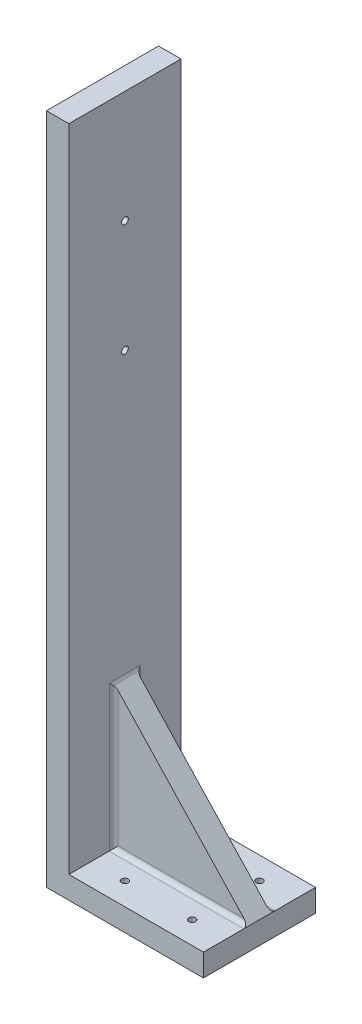
ISO-10303-21;
HEADER;
FILE_DESCRIPTION(('STEP AP214'),'2;1');
FILE_NAME('part.step','',(''),(''),'','','');
FILE_SCHEMA(('AUTOMOTIVE_DESIGN { 1 0 10303 214 1 1 1 1 }'));
ENDSEC;
DATA;
#1=APPLICATION_CONTEXT('core data for automotive mechanical design processes');
#2=APPLICATION_PROTOCOL_DEFINITION('international standard','automotive_design',2000,#1);
#3=PRODUCT_CONTEXT('',#1,'mechanical');
#4=PRODUCT('Part','Part','',(#3));
#5=PRODUCT_RELATED_PRODUCT_CATEGORY('part','',(#4));
#6=PRODUCT_DEFINITION_FORMATION('','',#4);
#7=PRODUCT_DEFINITION_CONTEXT('part definition',#1,'design');
#8=PRODUCT_DEFINITION('design','',#6,#7);
#9=PRODUCT_DEFINITION_SHAPE('','',#8);
#10=(LENGTH_UNIT() NAMED_UNIT(*) SI_UNIT(.MILLI.,.METRE.));
#11=(NAMED_UNIT(*) PLANE_ANGLE_UNIT() SI_UNIT($,.RADIAN.));
#12=(NAMED_UNIT(*) SI_UNIT($,.STERADIAN.) SOLID_ANGLE_UNIT());
#13=UNCERTAINTY_MEASURE_WITH_UNIT(LENGTH_MEASURE(1.E-05),#10,'distance_accuracy_value','');
#14=(GEOMETRIC_REPRESENTATION_CONTEXT(3) GLOBAL_UNCERTAINTY_ASSIGNED_CONTEXT((#13)) GLOBAL_UNIT_ASSIGNED_CONTEXT((#10,
#11,#12)) REPRESENTATION_CONTEXT('',''));
#15=CARTESIAN_POINT('',(0.,0.,0.));
#16=DIRECTION('',(0.,0.,1.));
#17=DIRECTION('',(1.,0.,0.));
#18=AXIS2_PLACEMENT_3D('',#15,#16,#17);
#19=CARTESIAN_POINT('',(0.,-213.28125,25.));
#20=DIRECTION('',(-1.,0.,0.));
#21=DIRECTION('',(0.,-1.,0.));
#22=AXIS2_PLACEMENT_3D('',#19,#20,#21);
#23=PLANE('',#22);
#24=CARTESIAN_POINT('',(0.,26.7187499999996,0.));
#25=DIRECTION('',(1.,0.,0.));
#26=DIRECTION('',(0.,1.,0.));
#27=AXIS2_PLACEMENT_3D('',#24,#25,#26);
#28=CIRCLE('',#27,1.5);
#29=CARTESIAN_POINT('',(0.,28.2187499999996,0.));
#30=VERTEX_POINT('',#29);
#31=EDGE_CURVE('E412',#30,#30,#28,.T.);
#32=ORIENTED_EDGE('',*,*,#31,.F.);
#33=EDGE_LOOP('',(#32));
#34=FACE_BOUND('',#33,.T.);
#35=CARTESIAN_POINT('',(0.,-23.2812500000004,0.));
#36=DIRECTION('',(1.,0.,0.));
#37=DIRECTION('',(0.,1.,0.));
#38=AXIS2_PLACEMENT_3D('',#35,#36,#37);
#39=CIRCLE('',#38,1.5);
#40=CARTESIAN_POINT('',(0.,-21.7812500000004,0.));
#41=VERTEX_POINT('',#40);
#42=EDGE_CURVE('E408',#41,#41,#39,.T.);
#43=ORIENTED_EDGE('',*,*,#42,.F.);
#44=EDGE_LOOP('',(#43));
#45=FACE_BOUND('',#44,.T.);
#46=DIRECTION('',(0.,0.,1.));
#47=VECTOR('',#46,1.);
#48=CARTESIAN_POINT('',(0.,-148.386625426611,-5.));
#49=LINE('',#48,#47);
#50=CARTESIAN_POINT('',(0.,-148.386625426611,7.));
#51=VERTEX_POINT('',#50);
#52=CARTESIAN_POINT('',(0.,-148.386625426611,-7.));
#53=VERTEX_POINT('',#52);
#54=EDGE_CURVE('E207',#51,#53,#49,.F.);
#55=ORIENTED_EDGE('',*,*,#54,.T.);
#56=DIRECTION('',(0.,1.,0.));
#57=VECTOR('',#56,1.);
#58=CARTESIAN_POINT('',(0.,-213.28125,-7.));
#59=LINE('',#58,#57);
#60=CARTESIAN_POINT('',(0.,-213.28125,-7.));
#61=VERTEX_POINT('',#60);
#62=EDGE_CURVE('E210',#53,#61,#59,.F.);
#63=ORIENTED_EDGE('',*,*,#62,.T.);
#64=DIRECTION('',(0.,0.,-1.));
#65=VECTOR('',#64,1.);
#66=CARTESIAN_POINT('',(0.,-213.28125,25.));
#67=LINE('',#66,#65);
#68=CARTESIAN_POINT('',(0.,-213.28125,-25.));
#69=VERTEX_POINT('',#68);
#70=EDGE_CURVE('E290',#61,#69,#67,.T.);
#71=ORIENTED_EDGE('',*,*,#70,.T.);
#72=DIRECTION('',(0.,1.,0.));
#73=VECTOR('',#72,1.);
#74=CARTESIAN_POINT('',(0.,-213.28125,-25.));
#75=LINE('',#74,#73);
#76=CARTESIAN_POINT('',(0.,76.7187499999996,-25.));
#77=VERTEX_POINT('',#76);
#78=EDGE_CURVE('E175',#69,#77,#75,.T.);
#79=ORIENTED_EDGE('',*,*,#78,.T.);
#80=DIRECTION('',(0.,0.,-1.));
#81=VECTOR('',#80,1.);
#82=CARTESIAN_POINT('',(0.,76.7187499999996,25.));
#83=LINE('',#82,#81);
#84=CARTESIAN_POINT('',(0.,76.7187499999996,25.));
#85=VERTEX_POINT('',#84);
#86=EDGE_CURVE('E155',#85,#77,#83,.T.);
#87=ORIENTED_EDGE('',*,*,#86,.F.);
#88=DIRECTION('',(0.,1.,0.));
#89=VECTOR('',#88,1.);
#90=CARTESIAN_POINT('',(0.,-213.28125,25.));
#91=LINE('',#90,#89);
#92=CARTESIAN_POINT('',(0.,-213.28125,25.));
#93=VERTEX_POINT('',#92);
#94=EDGE_CURVE('E162',#93,#85,#91,.T.);
#95=ORIENTED_EDGE('',*,*,#94,.F.);
#96=CARTESIAN_POINT('',(0.,-213.28125,7.00000000000001));
#97=VERTEX_POINT('',#96);
#98=EDGE_CURVE('E309',#93,#97,#67,.T.);
#99=ORIENTED_EDGE('',*,*,#98,.T.);
#100=DIRECTION('',(0.,-1.,0.));
#101=VECTOR('',#100,1.);
#102=CARTESIAN_POINT('',(0.,-149.176577693889,7.));
#103=LINE('',#102,#101);
#104=EDGE_CURVE('E181',#97,#51,#103,.F.);
#105=ORIENTED_EDGE('',*,*,#104,.T.);
#106=EDGE_LOOP('',(#55,#63,#71,#79,#87,#95,#99,#105));
#107=FACE_BOUND('',#106,.T.);
#108=ADVANCED_FACE('F44',(#34,#45,#107),#23,.F.);
#109=CARTESIAN_POINT('',(60.,-213.28125,25.));
#110=DIRECTION('',(0.,-1.,0.));
#111=DIRECTION('',(0.,0.,-1.));
#112=AXIS2_PLACEMENT_3D('',#109,#110,#111);
#113=PLANE('',#112);
#114=CARTESIAN_POINT('',(45.,-213.28125,15.));
#115=DIRECTION('',(0.,1.,0.));
#116=DIRECTION('',(0.,0.,-1.));
#117=AXIS2_PLACEMENT_3D('',#114,#115,#116);
#118=CIRCLE('',#117,1.5);
#119=CARTESIAN_POINT('',(45.,-213.28125,13.5));
#120=VERTEX_POINT('',#119);
#121=EDGE_CURVE('E259',#120,#120,#118,.T.);
#122=ORIENTED_EDGE('',*,*,#121,.F.);
#123=EDGE_LOOP('',(#122));
#124=FACE_BOUND('',#123,.T.);
#125=CARTESIAN_POINT('',(15.,-213.28125,15.));
#126=DIRECTION('',(0.,1.,0.));
#127=DIRECTION('',(0.,0.,1.));
#128=AXIS2_PLACEMENT_3D('',#125,#126,#127);
#129=CIRCLE('',#128,1.5);
#130=CARTESIAN_POINT('',(15.,-213.28125,16.5));
#131=VERTEX_POINT('',#130);
#132=EDGE_CURVE('E265',#131,#131,#129,.T.);
#133=ORIENTED_EDGE('',*,*,#132,.F.);
#134=EDGE_LOOP('',(#133));
#135=FACE_BOUND('',#134,.T.);
#136=DIRECTION('',(0.,0.,-1.));
#137=VECTOR('',#136,1.);
#138=CARTESIAN_POINT('',(60.,-213.28125,25.));
#139=LINE('',#138,#137);
#140=CARTESIAN_POINT('',(60.,-213.28125,25.));
#141=VERTEX_POINT('',#140);
#142=CARTESIAN_POINT('',(60.,-213.28125,7.00000000000001));
#143=VERTEX_POINT('',#142);
#144=EDGE_CURVE('E313',#141,#143,#139,.T.);
#145=ORIENTED_EDGE('',*,*,#144,.T.);
#146=DIRECTION('',(-1.,0.,0.));
#147=VECTOR('',#146,1.);
#148=CARTESIAN_POINT('',(0.,-213.28125,7.00000000000001));
#149=LINE('',#148,#147);
#150=EDGE_CURVE('E221',#143,#97,#149,.T.);
#151=ORIENTED_EDGE('',*,*,#150,.T.);
#152=ORIENTED_EDGE('',*,*,#98,.F.);
#153=DIRECTION('',(-1.,0.,0.));
#154=VECTOR('',#153,1.);
#155=CARTESIAN_POINT('',(60.,-213.28125,25.));
#156=LINE('',#155,#154);
#157=EDGE_CURVE('E167',#141,#93,#156,.T.);
#158=ORIENTED_EDGE('',*,*,#157,.F.);
#159=EDGE_LOOP('',(#145,#151,#152,#158));
#160=FACE_BOUND('',#159,.T.);
#161=ADVANCED_FACE('F352',(#124,#135,#160),#113,.F.);
#162=CARTESIAN_POINT('',(45.,-213.28125,-15.));
#163=DIRECTION('',(0.,1.,0.));
#164=DIRECTION('',(0.,0.,-1.));
#165=AXIS2_PLACEMENT_3D('',#162,#163,#164);
#166=CIRCLE('',#165,1.5);
#167=CARTESIAN_POINT('',(45.,-213.28125,-16.5));
#168=VERTEX_POINT('',#167);
#169=EDGE_CURVE('E253',#168,#168,#166,.T.);
#170=ORIENTED_EDGE('',*,*,#169,.F.);
#171=EDGE_LOOP('',(#170));
#172=FACE_BOUND('',#171,.T.);
#173=CARTESIAN_POINT('',(15.,-213.28125,-15.));
#174=DIRECTION('',(0.,1.,0.));
#175=DIRECTION('',(0.,0.,1.));
#176=AXIS2_PLACEMENT_3D('',#173,#174,#175);
#177=CIRCLE('',#176,1.5);
#178=CARTESIAN_POINT('',(15.,-213.28125,-13.5));
#179=VERTEX_POINT('',#178);
#180=EDGE_CURVE('E192',#179,#179,#177,.T.);
#181=ORIENTED_EDGE('',*,*,#180,.F.);
#182=EDGE_LOOP('',(#181));
#183=FACE_BOUND('',#182,.T.);
#184=ORIENTED_EDGE('',*,*,#70,.F.);
#185=DIRECTION('',(-1.,0.,0.));
#186=VECTOR('',#185,1.);
#187=CARTESIAN_POINT('',(60.,-213.28125,-7.));
#188=LINE('',#187,#186);
#189=CARTESIAN_POINT('',(60.,-213.28125,-7.));
#190=VERTEX_POINT('',#189);
#191=EDGE_CURVE('E218',#61,#190,#188,.F.);
#192=ORIENTED_EDGE('',*,*,#191,.T.);
#193=CARTESIAN_POINT('',(60.,-213.28125,-25.));
#194=VERTEX_POINT('',#193);
#195=EDGE_CURVE('E312',#190,#194,#139,.T.);
#196=ORIENTED_EDGE('',*,*,#195,.T.);
#197=DIRECTION('',(-1.,0.,0.));
#198=VECTOR('',#197,1.);
#199=CARTESIAN_POINT('',(60.,-213.28125,-25.));
#200=LINE('',#199,#198);
#201=EDGE_CURVE('E172',#194,#69,#200,.T.);
#202=ORIENTED_EDGE('',*,*,#201,.T.);
#203=EDGE_LOOP('',(#184,#192,#196,#202));
#204=FACE_BOUND('',#203,.T.);
#205=ADVANCED_FACE('F348',(#172,#183,#204),#113,.F.);
#206=CARTESIAN_POINT('',(0.,76.7187499999996,25.));
#207=DIRECTION('',(0.,-1.,0.));
#208=DIRECTION('',(0.,0.,-1.));
#209=AXIS2_PLACEMENT_3D('',#206,#207,#208);
#210=PLANE('',#209);
#211=DIRECTION('',(-1.,0.,0.));
#212=VECTOR('',#211,1.);
#213=CARTESIAN_POINT('',(0.,76.7187499999996,-25.));
#214=LINE('',#213,#212);
#215=CARTESIAN_POINT('',(-10.,76.7187499999996,-25.));
#216=VERTEX_POINT('',#215);
#217=EDGE_CURVE('E293',#77,#216,#214,.T.);
#218=ORIENTED_EDGE('',*,*,#217,.T.);
#219=DIRECTION('',(0.,0.,-1.));
#220=VECTOR('',#219,1.);
#221=CARTESIAN_POINT('',(-10.,76.7187499999996,25.));
#222=LINE('',#221,#220);
#223=CARTESIAN_POINT('',(-10.,76.7187499999996,25.));
#224=VERTEX_POINT('',#223);
#225=EDGE_CURVE('E157',#224,#216,#222,.T.);
#226=ORIENTED_EDGE('',*,*,#225,.F.);
#227=DIRECTION('',(-1.,0.,0.));
#228=VECTOR('',#227,1.);
#229=CARTESIAN_POINT('',(0.,76.7187499999996,25.));
#230=LINE('',#229,#228);
#231=EDGE_CURVE('E151',#85,#224,#230,.T.);
#232=ORIENTED_EDGE('',*,*,#231,.F.);
#233=ORIENTED_EDGE('',*,*,#86,.T.);
#234=EDGE_LOOP('',(#218,#226,#232,#233));
#235=FACE_BOUND('',#234,.T.);
#236=ADVANCED_FACE('F153',(#235),#210,.F.);
#237=CARTESIAN_POINT('',(-10.,76.7187499999996,25.));
#238=DIRECTION('',(1.,0.,0.));
#239=DIRECTION('',(0.,1.,0.));
#240=AXIS2_PLACEMENT_3D('',#237,#238,#239);
#241=PLANE('',#240);
#242=CARTESIAN_POINT('',(-10.,26.7187499999996,0.));
#243=DIRECTION('',(1.,0.,0.));
#244=DIRECTION('',(0.,1.,0.));
#245=AXIS2_PLACEMENT_3D('',#242,#243,#244);
#246=CIRCLE('',#245,1.5);
#247=CARTESIAN_POINT('',(-10.,28.2187499999996,0.));
#248=VERTEX_POINT('',#247);
#249=EDGE_CURVE('E242',#248,#248,#246,.T.);
#250=ORIENTED_EDGE('',*,*,#249,.T.);
#251=EDGE_LOOP('',(#250));
#252=FACE_BOUND('',#251,.T.);
#253=CARTESIAN_POINT('',(-10.,-23.2812500000004,0.));
#254=DIRECTION('',(1.,0.,0.));
#255=DIRECTION('',(0.,1.,0.));
#256=AXIS2_PLACEMENT_3D('',#253,#254,#255);
#257=CIRCLE('',#256,1.5);
#258=CARTESIAN_POINT('',(-10.,-21.7812500000004,0.));
#259=VERTEX_POINT('',#258);
#260=EDGE_CURVE('E404',#259,#259,#257,.T.);
#261=ORIENTED_EDGE('',*,*,#260,.T.);
#262=EDGE_LOOP('',(#261));
#263=FACE_BOUND('',#262,.T.);
#264=DIRECTION('',(0.,-1.,0.));
#265=VECTOR('',#264,1.);
#266=CARTESIAN_POINT('',(-10.,76.7187499999996,-25.));
#267=LINE('',#266,#265);
#268=CARTESIAN_POINT('',(-9.99999999999996,-223.28125,-25.));
#269=VERTEX_POINT('',#268);
#270=EDGE_CURVE('E296',#216,#269,#267,.T.);
#271=ORIENTED_EDGE('',*,*,#270,.T.);
#272=DIRECTION('',(0.,0.,-1.));
#273=VECTOR('',#272,1.);
#274=CARTESIAN_POINT('',(-9.99999999999996,-223.28125,25.));
#275=LINE('',#274,#273);
#276=CARTESIAN_POINT('',(-9.99999999999996,-223.28125,25.));
#277=VERTEX_POINT('',#276);
#278=EDGE_CURVE('E183',#277,#269,#275,.T.);
#279=ORIENTED_EDGE('',*,*,#278,.F.);
#280=DIRECTION('',(0.,-1.,0.));
#281=VECTOR('',#280,1.);
#282=CARTESIAN_POINT('',(-10.,76.7187499999996,25.));
#283=LINE('',#282,#281);
#284=EDGE_CURVE('E161',#224,#277,#283,.T.);
#285=ORIENTED_EDGE('',*,*,#284,.F.);
#286=ORIENTED_EDGE('',*,*,#225,.T.);
#287=EDGE_LOOP('',(#271,#279,#285,#286));
#288=FACE_BOUND('',#287,.T.);
#289=ADVANCED_FACE('F336',(#252,#263,#288),#241,.F.);
#290=CARTESIAN_POINT('',(-9.99999999999996,-223.28125,25.));
#291=DIRECTION('',(0.,1.,0.));
#292=DIRECTION('',(0.,0.,1.));
#293=AXIS2_PLACEMENT_3D('',#290,#291,#292);
#294=PLANE('',#293);
#295=CARTESIAN_POINT('',(45.,-223.28125,-15.));
#296=DIRECTION('',(0.,1.,0.));
#297=DIRECTION('',(0.,0.,1.));
#298=AXIS2_PLACEMENT_3D('',#295,#296,#297);
#299=CIRCLE('',#298,1.5);
#300=CARTESIAN_POINT('',(45.,-223.28125,-13.5));
#301=VERTEX_POINT('',#300);
#302=EDGE_CURVE('E200',#301,#301,#299,.T.);
#303=ORIENTED_EDGE('',*,*,#302,.T.);
#304=EDGE_LOOP('',(#303));
#305=FACE_BOUND('',#304,.T.);
#306=CARTESIAN_POINT('',(45.,-223.28125,15.));
#307=DIRECTION('',(0.,1.,0.));
#308=DIRECTION('',(0.,0.,1.));
#309=AXIS2_PLACEMENT_3D('',#306,#307,#308);
#310=CIRCLE('',#309,1.5);
#311=CARTESIAN_POINT('',(45.,-223.28125,16.5));
#312=VERTEX_POINT('',#311);
#313=EDGE_CURVE('E196',#312,#312,#310,.T.);
#314=ORIENTED_EDGE('',*,*,#313,.T.);
#315=EDGE_LOOP('',(#314));
#316=FACE_BOUND('',#315,.T.);
#317=CARTESIAN_POINT('',(15.,-223.28125,15.));
#318=DIRECTION('',(0.,1.,0.));
#319=DIRECTION('',(0.,0.,1.));
#320=AXIS2_PLACEMENT_3D('',#317,#318,#319);
#321=CIRCLE('',#320,1.5);
#322=CARTESIAN_POINT('',(15.,-223.28125,16.5));
#323=VERTEX_POINT('',#322);
#324=EDGE_CURVE('E191',#323,#323,#321,.T.);
#325=ORIENTED_EDGE('',*,*,#324,.T.);
#326=EDGE_LOOP('',(#325));
#327=FACE_BOUND('',#326,.T.);
#328=CARTESIAN_POINT('',(15.,-223.28125,-15.));
#329=DIRECTION('',(0.,1.,0.));
#330=DIRECTION('',(0.,0.,1.));
#331=AXIS2_PLACEMENT_3D('',#328,#329,#330);
#332=CIRCLE('',#331,1.5);
#333=CARTESIAN_POINT('',(15.,-223.28125,-13.5));
#334=VERTEX_POINT('',#333);
#335=EDGE_CURVE('E187',#334,#334,#332,.T.);
#336=ORIENTED_EDGE('',*,*,#335,.T.);
#337=EDGE_LOOP('',(#336));
#338=FACE_BOUND('',#337,.T.);
#339=DIRECTION('',(1.,0.,0.));
#340=VECTOR('',#339,1.);
#341=CARTESIAN_POINT('',(-9.99999999999996,-223.28125,-25.));
#342=LINE('',#341,#340);
#343=CARTESIAN_POINT('',(60.,-223.28125,-25.));
#344=VERTEX_POINT('',#343);
#345=EDGE_CURVE('E299',#269,#344,#342,.T.);
#346=ORIENTED_EDGE('',*,*,#345,.T.);
#347=DIRECTION('',(0.,0.,-1.));
#348=VECTOR('',#347,1.);
#349=CARTESIAN_POINT('',(60.,-223.28125,25.));
#350=LINE('',#349,#348);
#351=CARTESIAN_POINT('',(60.,-223.28125,25.));
#352=VERTEX_POINT('',#351);
#353=EDGE_CURVE('E316',#352,#344,#350,.T.);
#354=ORIENTED_EDGE('',*,*,#353,.F.);
#355=DIRECTION('',(1.,0.,0.));
#356=VECTOR('',#355,1.);
#357=CARTESIAN_POINT('',(-9.99999999999996,-223.28125,25.));
#358=LINE('',#357,#356);
#359=EDGE_CURVE('E282',#277,#352,#358,.T.);
#360=ORIENTED_EDGE('',*,*,#359,.F.);
#361=ORIENTED_EDGE('',*,*,#278,.T.);
#362=EDGE_LOOP('',(#346,#354,#360,#361));
#363=FACE_BOUND('',#362,.T.);
#364=ADVANCED_FACE('F325',(#305,#316,#327,#338,#363),#294,.F.);
#365=CARTESIAN_POINT('',(60.,-223.28125,25.));
#366=DIRECTION('',(-1.,0.,0.));
#367=DIRECTION('',(0.,0.,1.));
#368=AXIS2_PLACEMENT_3D('',#365,#366,#367);
#369=PLANE('',#368);
#370=ORIENTED_EDGE('',*,*,#195,.F.);
#371=DIRECTION('',(0.,0.,1.));
#372=VECTOR('',#371,1.);
#373=CARTESIAN_POINT('',(60.,-213.28125,-55.));
#374=LINE('',#373,#372);
#375=EDGE_CURVE('E62',#190,#143,#374,.T.);
#376=ORIENTED_EDGE('',*,*,#375,.T.);
#377=ORIENTED_EDGE('',*,*,#144,.F.);
#378=DIRECTION('',(0.,1.,0.));
#379=VECTOR('',#378,1.);
#380=CARTESIAN_POINT('',(60.,-223.28125,25.));
#381=LINE('',#380,#379);
#382=EDGE_CURVE('E285',#352,#141,#381,.T.);
#383=ORIENTED_EDGE('',*,*,#382,.F.);
#384=ORIENTED_EDGE('',*,*,#353,.T.);
#385=DIRECTION('',(0.,1.,0.));
#386=VECTOR('',#385,1.);
#387=CARTESIAN_POINT('',(60.,-223.28125,-25.));
#388=LINE('',#387,#386);
#389=EDGE_CURVE('E302',#344,#194,#388,.T.);
#390=ORIENTED_EDGE('',*,*,#389,.T.);
#391=EDGE_LOOP('',(#370,#376,#377,#383,#384,#390));
#392=FACE_BOUND('',#391,.T.);
#393=ADVANCED_FACE('F333',(#392),#369,.F.);
#394=CARTESIAN_POINT('',(0.,0.,25.));
#395=DIRECTION('',(0.,0.,1.));
#396=DIRECTION('',(1.,0.,0.));
#397=AXIS2_PLACEMENT_3D('',#394,#395,#396);
#398=PLANE('',#397);
#399=ORIENTED_EDGE('',*,*,#94,.T.);
#400=ORIENTED_EDGE('',*,*,#231,.T.);
#401=ORIENTED_EDGE('',*,*,#284,.T.);
#402=ORIENTED_EDGE('',*,*,#359,.T.);
#403=ORIENTED_EDGE('',*,*,#382,.T.);
#404=ORIENTED_EDGE('',*,*,#157,.T.);
#405=EDGE_LOOP('',(#399,#400,#401,#402,#403,#404));
#406=FACE_BOUND('',#405,.T.);
#407=ADVANCED_FACE('F165',(#406),#398,.T.);
#408=CARTESIAN_POINT('',(0.,0.,-25.));
#409=DIRECTION('',(0.,0.,1.));
#410=DIRECTION('',(1.,0.,0.));
#411=AXIS2_PLACEMENT_3D('',#408,#409,#410);
#412=PLANE('',#411);
#413=ORIENTED_EDGE('',*,*,#78,.F.);
#414=ORIENTED_EDGE('',*,*,#201,.F.);
#415=ORIENTED_EDGE('',*,*,#389,.F.);
#416=ORIENTED_EDGE('',*,*,#345,.F.);
#417=ORIENTED_EDGE('',*,*,#270,.F.);
#418=ORIENTED_EDGE('',*,*,#217,.F.);
#419=EDGE_LOOP('',(#413,#414,#415,#416,#417,#418));
#420=FACE_BOUND('',#419,.T.);
#421=ADVANCED_FACE('F331',(#420),#412,.F.);
#422=CARTESIAN_POINT('',(60.,-213.28125,5.));
#423=DIRECTION('',(0.,0.,-1.));
#424=DIRECTION('',(0.,1.,0.));
#425=AXIS2_PLACEMENT_3D('',#422,#423,#424);
#426=PLANE('',#425);
#427=DIRECTION('',(0.,-1.,0.));
#428=VECTOR('',#427,1.);
#429=CARTESIAN_POINT('',(2.00000000000003,-213.28125,5.));
#430=LINE('',#429,#428);
#431=CARTESIAN_POINT('',(2.00000000000002,-151.313400104093,5.));
#432=VERTEX_POINT('',#431);
#433=CARTESIAN_POINT('',(2.00000000000003,-211.28125,5.));
#434=VERTEX_POINT('',#433);
#435=EDGE_CURVE('E224',#432,#434,#430,.T.);
#436=ORIENTED_EDGE('',*,*,#435,.T.);
#437=DIRECTION('',(-1.,0.,0.));
#438=VECTOR('',#437,1.);
#439=CARTESIAN_POINT('',(60.,-211.28125,5.));
#440=LINE('',#439,#438);
#441=CARTESIAN_POINT('',(58.1280615642651,-211.28125,5.));
#442=VERTEX_POINT('',#441);
#443=EDGE_CURVE('E227',#434,#442,#440,.F.);
#444=ORIENTED_EDGE('',*,*,#443,.T.);
#445=DIRECTION('',(0.683346079008992,-0.73009460777562,0.));
#446=VECTOR('',#445,1.);
#447=CARTESIAN_POINT('',(0.,-149.176577693889,5.));
#448=LINE('',#447,#446);
#449=EDGE_CURVE('E203',#432,#442,#448,.T.);
#450=ORIENTED_EDGE('',*,*,#449,.F.);
#451=EDGE_LOOP('',(#436,#444,#450));
#452=FACE_BOUND('',#451,.T.);
#453=ADVANCED_FACE('F388',(#452),#426,.F.);
#454=CARTESIAN_POINT('',(60.,-213.28125,-5.));
#455=DIRECTION('',(0.,0.,1.));
#456=DIRECTION('',(0.,-1.,0.));
#457=AXIS2_PLACEMENT_3D('',#454,#455,#456);
#458=PLANE('',#457);
#459=DIRECTION('',(0.683346079008992,-0.73009460777562,0.));
#460=VECTOR('',#459,1.);
#461=CARTESIAN_POINT('',(60.,-213.28125,-5.));
#462=LINE('',#461,#460);
#463=CARTESIAN_POINT('',(2.00000000000003,-151.313400104093,-5.));
#464=VERTEX_POINT('',#463);
#465=CARTESIAN_POINT('',(58.1280615642652,-211.28125,-5.));
#466=VERTEX_POINT('',#465);
#467=EDGE_CURVE('E277',#464,#466,#462,.T.);
#468=ORIENTED_EDGE('',*,*,#467,.T.);
#469=DIRECTION('',(-1.,0.,0.));
#470=VECTOR('',#469,1.);
#471=CARTESIAN_POINT('',(0.,-211.28125,-5.));
#472=LINE('',#471,#470);
#473=CARTESIAN_POINT('',(2.00000000000003,-211.28125,-5.));
#474=VERTEX_POINT('',#473);
#475=EDGE_CURVE('E90',#466,#474,#472,.T.);
#476=ORIENTED_EDGE('',*,*,#475,.T.);
#477=DIRECTION('',(0.,1.,0.));
#478=VECTOR('',#477,1.);
#479=CARTESIAN_POINT('',(2.00000000000002,-149.176577693889,-5.));
#480=LINE('',#479,#478);
#481=EDGE_CURVE('E213',#474,#464,#480,.T.);
#482=ORIENTED_EDGE('',*,*,#481,.T.);
#483=EDGE_LOOP('',(#468,#476,#482));
#484=FACE_BOUND('',#483,.T.);
#485=ADVANCED_FACE('F394',(#484),#458,.F.);
#486=CARTESIAN_POINT('',(0.,-149.176577693889,-55.));
#487=DIRECTION('',(-0.73009460777562,-0.683346079008992,0.));
#488=DIRECTION('',(0.683346079008992,-0.73009460777562,0.));
#489=AXIS2_PLACEMENT_3D('',#486,#487,#488);
#490=PLANE('',#489);
#491=ORIENTED_EDGE('',*,*,#467,.F.);
#492=CARTESIAN_POINT('',(2.00000000000002,-151.313400104093,-7.));
#493=DIRECTION('',(-0.73009460777562,-0.683346079008992,0.));
#494=DIRECTION('',(0.683346079008992,-0.73009460777562,0.));
#495=AXIS2_PLACEMENT_3D('',#492,#493,#494);
#496=ELLIPSE('',#495,2.92677467748181,2.);
#497=CARTESIAN_POINT('',(0.539810784448773,-149.753317584629,-5.63330784198202));
#498=VERTEX_POINT('',#497);
#499=EDGE_CURVE('E233',#464,#498,#496,.T.);
#500=ORIENTED_EDGE('',*,*,#499,.T.);
#501=DIRECTION('',(0.,0.,1.));
#502=VECTOR('',#501,1.);
#503=CARTESIAN_POINT('',(0.539810784448773,-149.753317584629,5.));
#504=LINE('',#503,#502);
#505=CARTESIAN_POINT('',(0.539810784448773,-149.753317584629,5.63330784198203));
#506=VERTEX_POINT('',#505);
#507=EDGE_CURVE('E71',#498,#506,#504,.T.);
#508=ORIENTED_EDGE('',*,*,#507,.T.);
#509=CARTESIAN_POINT('',(2.00000000000002,-151.313400104093,7.));
#510=DIRECTION('',(-0.73009460777562,-0.683346079008992,0.));
#511=DIRECTION('',(-0.683346079008992,0.73009460777562,0.));
#512=AXIS2_PLACEMENT_3D('',#509,#510,#511);
#513=ELLIPSE('',#512,2.92677467748181,2.);
#514=EDGE_CURVE('E11',#506,#432,#513,.T.);
#515=ORIENTED_EDGE('',*,*,#514,.T.);
#516=ORIENTED_EDGE('',*,*,#449,.T.);
#517=CARTESIAN_POINT('',(58.1280615642651,-211.28125,7.00000000000001));
#518=DIRECTION('',(-0.73009460777562,-0.683346079008992,0.));
#519=DIRECTION('',(0.683346079008992,-0.73009460777562,0.));
#520=AXIS2_PLACEMENT_3D('',#517,#518,#519);
#521=ELLIPSE('',#520,2.73937100575691,2.);
#522=EDGE_CURVE('E54',#442,#143,#521,.T.);
#523=ORIENTED_EDGE('',*,*,#522,.T.);
#524=ORIENTED_EDGE('',*,*,#375,.F.);
#525=CARTESIAN_POINT('',(58.1280615642651,-211.28125,-7.));
#526=DIRECTION('',(-0.73009460777562,-0.683346079008992,0.));
#527=DIRECTION('',(0.683346079008992,-0.73009460777562,0.));
#528=AXIS2_PLACEMENT_3D('',#525,#526,#527);
#529=ELLIPSE('',#528,2.73937100575691,2.);
#530=EDGE_CURVE('E230',#190,#466,#529,.T.);
#531=ORIENTED_EDGE('',*,*,#530,.T.);
#532=EDGE_LOOP('',(#491,#500,#508,#515,#516,#523,#524,#531));
#533=FACE_BOUND('',#532,.T.);
#534=ADVANCED_FACE('F384',(#533),#490,.F.);
#535=CARTESIAN_POINT('',(15.,-273.28125,-15.));
#536=DIRECTION('',(0.,1.,0.));
#537=DIRECTION('',(0.,0.,1.));
#538=AXIS2_PLACEMENT_3D('',#535,#536,#537);
#539=CYLINDRICAL_SURFACE('',#538,1.5);
#540=ORIENTED_EDGE('',*,*,#180,.T.);
#541=EDGE_LOOP('',(#540));
#542=FACE_BOUND('',#541,.T.);
#543=ORIENTED_EDGE('',*,*,#335,.F.);
#544=EDGE_LOOP('',(#543));
#545=FACE_BOUND('',#544,.T.);
#546=ADVANCED_FACE('F432',(#542,#545),#539,.F.);
#547=CARTESIAN_POINT('',(15.,-273.28125,15.));
#548=DIRECTION('',(0.,1.,0.));
#549=DIRECTION('',(0.,0.,1.));
#550=AXIS2_PLACEMENT_3D('',#547,#548,#549);
#551=CYLINDRICAL_SURFACE('',#550,1.5);
#552=ORIENTED_EDGE('',*,*,#132,.T.);
#553=EDGE_LOOP('',(#552));
#554=FACE_BOUND('',#553,.T.);
#555=ORIENTED_EDGE('',*,*,#324,.F.);
#556=EDGE_LOOP('',(#555));
#557=FACE_BOUND('',#556,.T.);
#558=ADVANCED_FACE('F428',(#554,#557),#551,.F.);
#559=CARTESIAN_POINT('',(45.,-273.28125,15.));
#560=DIRECTION('',(0.,1.,0.));
#561=DIRECTION('',(0.,0.,1.));
#562=AXIS2_PLACEMENT_3D('',#559,#560,#561);
#563=CYLINDRICAL_SURFACE('',#562,1.5);
#564=ORIENTED_EDGE('',*,*,#121,.T.);
#565=EDGE_LOOP('',(#564));
#566=FACE_BOUND('',#565,.T.);
#567=ORIENTED_EDGE('',*,*,#313,.F.);
#568=EDGE_LOOP('',(#567));
#569=FACE_BOUND('',#568,.T.);
#570=ADVANCED_FACE('F431',(#566,#569),#563,.F.);
#571=CARTESIAN_POINT('',(45.,-273.28125,-15.));
#572=DIRECTION('',(0.,1.,0.));
#573=DIRECTION('',(0.,0.,1.));
#574=AXIS2_PLACEMENT_3D('',#571,#572,#573);
#575=CYLINDRICAL_SURFACE('',#574,1.5);
#576=ORIENTED_EDGE('',*,*,#169,.T.);
#577=EDGE_LOOP('',(#576));
#578=FACE_BOUND('',#577,.T.);
#579=ORIENTED_EDGE('',*,*,#302,.F.);
#580=EDGE_LOOP('',(#579));
#581=FACE_BOUND('',#580,.T.);
#582=ADVANCED_FACE('F378',(#578,#581),#575,.F.);
#583=CARTESIAN_POINT('',(60.,-211.28125,-7.));
#584=DIRECTION('',(1.,0.,0.));
#585=DIRECTION('',(0.,0.,-1.));
#586=AXIS2_PLACEMENT_3D('',#583,#584,#585);
#587=CYLINDRICAL_SURFACE('',#586,2.);
#588=ORIENTED_EDGE('',*,*,#530,.F.);
#589=ORIENTED_EDGE('',*,*,#191,.F.);
#590=CARTESIAN_POINT('',(2.00000000000003,-211.28125,-7.));
#591=DIRECTION('',(0.707106781186547,-0.707106781186547,0.));
#592=DIRECTION('',(0.707106781186547,0.707106781186548,0.));
#593=AXIS2_PLACEMENT_3D('',#590,#591,#592);
#594=ELLIPSE('',#593,2.82842712474619,2.);
#595=EDGE_CURVE('E48',#474,#61,#594,.T.);
#596=ORIENTED_EDGE('',*,*,#595,.F.);
#597=ORIENTED_EDGE('',*,*,#475,.F.);
#598=EDGE_LOOP('',(#588,#589,#596,#597));
#599=FACE_BOUND('',#598,.T.);
#600=ADVANCED_FACE('F46',(#599),#587,.F.);
#601=CARTESIAN_POINT('',(60.,-211.28125,7.00000000000001));
#602=DIRECTION('',(1.,0.,0.));
#603=DIRECTION('',(0.,0.,-1.));
#604=AXIS2_PLACEMENT_3D('',#601,#602,#603);
#605=CYLINDRICAL_SURFACE('',#604,2.);
#606=ORIENTED_EDGE('',*,*,#522,.F.);
#607=ORIENTED_EDGE('',*,*,#443,.F.);
#608=CARTESIAN_POINT('',(2.00000000000003,-211.28125,7.00000000000001));
#609=DIRECTION('',(0.707106781186547,-0.707106781186547,0.));
#610=DIRECTION('',(0.707106781186547,0.707106781186548,0.));
#611=AXIS2_PLACEMENT_3D('',#608,#609,#610);
#612=ELLIPSE('',#611,2.82842712474619,2.);
#613=EDGE_CURVE('E244',#97,#434,#612,.T.);
#614=ORIENTED_EDGE('',*,*,#613,.F.);
#615=ORIENTED_EDGE('',*,*,#150,.F.);
#616=EDGE_LOOP('',(#606,#607,#614,#615));
#617=FACE_BOUND('',#616,.T.);
#618=ADVANCED_FACE('F372',(#617),#605,.F.);
#619=CARTESIAN_POINT('',(2.00000000000003,-213.28125,-7.));
#620=DIRECTION('',(0.,-1.,0.));
#621=DIRECTION('',(1.,0.,0.));
#622=AXIS2_PLACEMENT_3D('',#619,#620,#621);
#623=CYLINDRICAL_SURFACE('',#622,2.);
#624=ORIENTED_EDGE('',*,*,#595,.T.);
#625=ORIENTED_EDGE('',*,*,#62,.F.);
#626=CARTESIAN_POINT('',(2.00000000000002,-148.386625426611,-7.));
#627=DIRECTION('',(0.,-0.707106781186547,-0.707106781186547));
#628=DIRECTION('',(0.,-0.707106781186547,0.707106781186547));
#629=AXIS2_PLACEMENT_3D('',#626,#627,#628);
#630=ELLIPSE('',#629,2.82842712474619,2.);
#631=EDGE_CURVE('E241',#498,#53,#630,.T.);
#632=ORIENTED_EDGE('',*,*,#631,.F.);
#633=ORIENTED_EDGE('',*,*,#499,.F.);
#634=ORIENTED_EDGE('',*,*,#481,.F.);
#635=EDGE_LOOP('',(#624,#625,#632,#633,#634));
#636=FACE_BOUND('',#635,.T.);
#637=ADVANCED_FACE('F370',(#636),#623,.F.);
#638=CARTESIAN_POINT('',(2.00000000000003,-213.28125,7.));
#639=DIRECTION('',(0.,1.,0.));
#640=DIRECTION('',(-1.,0.,0.));
#641=AXIS2_PLACEMENT_3D('',#638,#639,#640);
#642=CYLINDRICAL_SURFACE('',#641,2.);
#643=ORIENTED_EDGE('',*,*,#435,.F.);
#644=ORIENTED_EDGE('',*,*,#514,.F.);
#645=CARTESIAN_POINT('',(2.00000000000002,-148.386625426611,7.));
#646=DIRECTION('',(0.,0.707106781186547,-0.707106781186547));
#647=DIRECTION('',(0.,0.707106781186547,0.707106781186547));
#648=AXIS2_PLACEMENT_3D('',#645,#646,#647);
#649=ELLIPSE('',#648,2.82842712474619,2.);
#650=EDGE_CURVE('E238',#51,#506,#649,.F.);
#651=ORIENTED_EDGE('',*,*,#650,.F.);
#652=ORIENTED_EDGE('',*,*,#104,.F.);
#653=ORIENTED_EDGE('',*,*,#613,.T.);
#654=EDGE_LOOP('',(#643,#644,#651,#652,#653));
#655=FACE_BOUND('',#654,.T.);
#656=ADVANCED_FACE('F367',(#655),#642,.F.);
#657=CARTESIAN_POINT('',(2.00000000000002,-148.386625426611,-55.));
#658=DIRECTION('',(0.,0.,-1.));
#659=DIRECTION('',(-1.,0.,0.));
#660=AXIS2_PLACEMENT_3D('',#657,#658,#659);
#661=CYLINDRICAL_SURFACE('',#660,2.);
#662=ORIENTED_EDGE('',*,*,#631,.T.);
#663=ORIENTED_EDGE('',*,*,#54,.F.);
#664=ORIENTED_EDGE('',*,*,#650,.T.);
#665=ORIENTED_EDGE('',*,*,#507,.F.);
#666=EDGE_LOOP('',(#662,#663,#664,#665));
#667=FACE_BOUND('',#666,.T.);
#668=ADVANCED_FACE('F364',(#667),#661,.F.);
#669=CARTESIAN_POINT('',(-10.,-23.2812500000004,0.));
#670=DIRECTION('',(1.,0.,0.));
#671=DIRECTION('',(0.,1.,0.));
#672=AXIS2_PLACEMENT_3D('',#669,#670,#671);
#673=CYLINDRICAL_SURFACE('',#672,1.5);
#674=ORIENTED_EDGE('',*,*,#260,.F.);
#675=EDGE_LOOP('',(#674));
#676=FACE_BOUND('',#675,.T.);
#677=ORIENTED_EDGE('',*,*,#42,.T.);
#678=EDGE_LOOP('',(#677));
#679=FACE_BOUND('',#678,.T.);
#680=ADVANCED_FACE('F366',(#676,#679),#673,.F.);
#681=CARTESIAN_POINT('',(-10.,26.7187499999996,0.));
#682=DIRECTION('',(1.,0.,0.));
#683=DIRECTION('',(0.,1.,0.));
#684=AXIS2_PLACEMENT_3D('',#681,#682,#683);
#685=CYLINDRICAL_SURFACE('',#684,1.5);
#686=ORIENTED_EDGE('',*,*,#249,.F.);
#687=EDGE_LOOP('',(#686));
#688=FACE_BOUND('',#687,.T.);
#689=ORIENTED_EDGE('',*,*,#31,.T.);
#690=EDGE_LOOP('',(#689));
#691=FACE_BOUND('',#690,.T.);
#692=ADVANCED_FACE('F419',(#688,#691),#685,.F.);
#693=CLOSED_SHELL('',(#108,#161,#205,#236,#289,#364,#393,#407,#421,#453,#485,#534,#546,#558,
#570,#582,#600,#618,#637,#656,#668,#680,#692));
#694=MANIFOLD_SOLID_BREP('B2',#693);
#695=ADVANCED_BREP_SHAPE_REPRESENTATION('',(#18,#694),#14);
#696=SHAPE_DEFINITION_REPRESENTATION(#9,#695);
ENDSEC;
END-ISO-10303-21;
